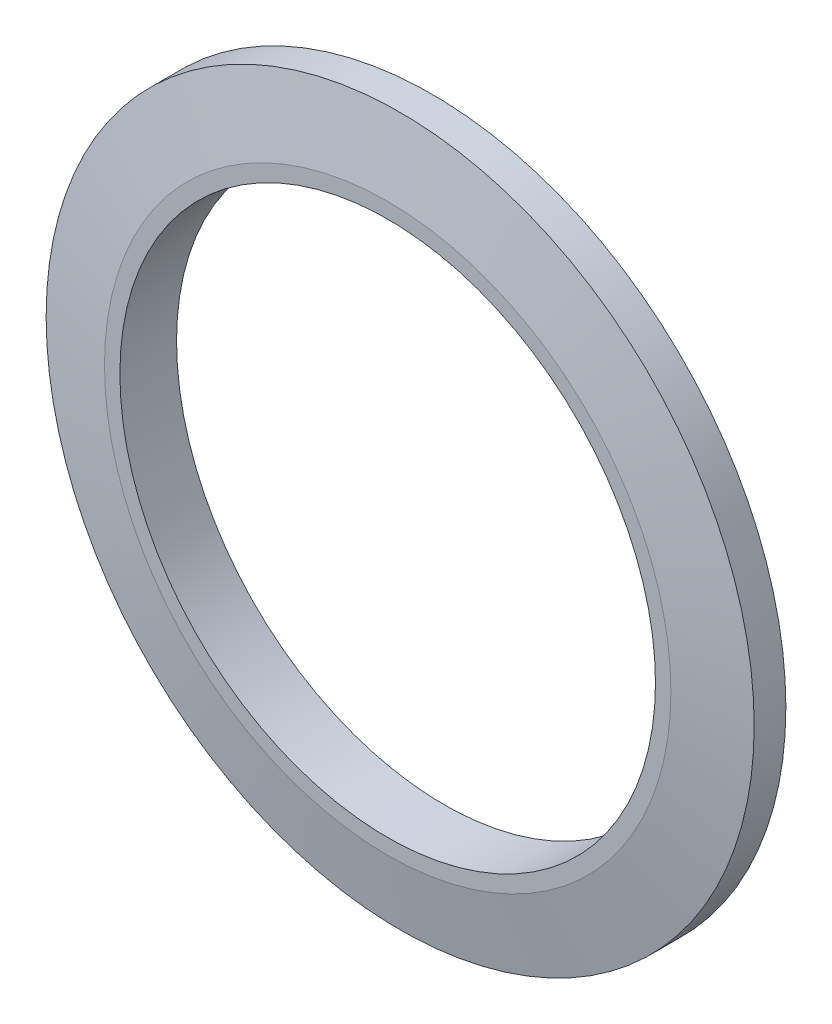
ISO-10303-21;
HEADER;
FILE_DESCRIPTION(('STEP AP214'),'2;1');
FILE_NAME('part.step','',(''),(''),'','','');
FILE_SCHEMA(('AUTOMOTIVE_DESIGN { 1 0 10303 214 1 1 1 1 }'));
ENDSEC;
DATA;
#1=APPLICATION_CONTEXT('core data for automotive mechanical design processes');
#2=APPLICATION_PROTOCOL_DEFINITION('international standard','automotive_design',2000,#1);
#3=PRODUCT_CONTEXT('',#1,'mechanical');
#4=PRODUCT('Part','Part','',(#3));
#5=PRODUCT_RELATED_PRODUCT_CATEGORY('part','',(#4));
#6=PRODUCT_DEFINITION_FORMATION('','',#4);
#7=PRODUCT_DEFINITION_CONTEXT('part definition',#1,'design');
#8=PRODUCT_DEFINITION('design','',#6,#7);
#9=PRODUCT_DEFINITION_SHAPE('','',#8);
#10=(LENGTH_UNIT() NAMED_UNIT(*) SI_UNIT(.MILLI.,.METRE.));
#11=(NAMED_UNIT(*) PLANE_ANGLE_UNIT() SI_UNIT($,.RADIAN.));
#12=(NAMED_UNIT(*) SI_UNIT($,.STERADIAN.) SOLID_ANGLE_UNIT());
#13=UNCERTAINTY_MEASURE_WITH_UNIT(LENGTH_MEASURE(1.E-05),#10,'distance_accuracy_value','');
#14=(GEOMETRIC_REPRESENTATION_CONTEXT(3) GLOBAL_UNCERTAINTY_ASSIGNED_CONTEXT((#13)) GLOBAL_UNIT_ASSIGNED_CONTEXT((#10,
#11,#12)) REPRESENTATION_CONTEXT('',''));
#15=CARTESIAN_POINT('',(0.,0.,0.));
#16=DIRECTION('',(0.,0.,1.));
#17=DIRECTION('',(1.,0.,0.));
#18=AXIS2_PLACEMENT_3D('',#15,#16,#17);
#19=CARTESIAN_POINT('',(0.,0.,2.));
#20=DIRECTION('',(0.,0.,1.));
#21=DIRECTION('',(1.,0.,0.));
#22=AXIS2_PLACEMENT_3D('',#19,#20,#21);
#23=PLANE('',#22);
#24=CARTESIAN_POINT('',(0.,0.,2.));
#25=DIRECTION('',(0.,0.,1.));
#26=DIRECTION('',(1.,0.,0.));
#27=AXIS2_PLACEMENT_3D('',#24,#25,#26);
#28=CIRCLE('',#27,9.455);
#29=CARTESIAN_POINT('',(9.455,0.,2.));
#30=VERTEX_POINT('',#29);
#31=EDGE_CURVE('E45',#30,#30,#28,.T.);
#32=ORIENTED_EDGE('',*,*,#31,.F.);
#33=EDGE_LOOP('',(#32));
#34=FACE_BOUND('',#33,.T.);
#35=CARTESIAN_POINT('',(0.,0.,2.));
#36=DIRECTION('',(0.,0.,-1.));
#37=DIRECTION('',(-1.,0.,0.));
#38=AXIS2_PLACEMENT_3D('',#35,#36,#37);
#39=CIRCLE('',#38,10.);
#40=CARTESIAN_POINT('',(-10.,0.,2.));
#41=VERTEX_POINT('',#40);
#42=EDGE_CURVE('E61',#41,#41,#39,.T.);
#43=ORIENTED_EDGE('',*,*,#42,.F.);
#44=EDGE_LOOP('',(#43));
#45=FACE_BOUND('',#44,.T.);
#46=ADVANCED_FACE('F41',(#34,#45),#23,.T.);
#47=CARTESIAN_POINT('',(0.,0.,0.));
#48=DIRECTION('',(0.,0.,1.));
#49=DIRECTION('',(1.,0.,0.));
#50=AXIS2_PLACEMENT_3D('',#47,#48,#49);
#51=PLANE('',#50);
#52=CARTESIAN_POINT('',(0.,0.,0.));
#53=DIRECTION('',(0.,0.,1.));
#54=DIRECTION('',(1.,0.,0.));
#55=AXIS2_PLACEMENT_3D('',#52,#53,#54);
#56=CIRCLE('',#55,9.455);
#57=CARTESIAN_POINT('',(9.455,0.,0.));
#58=VERTEX_POINT('',#57);
#59=EDGE_CURVE('E10',#58,#58,#56,.T.);
#60=ORIENTED_EDGE('',*,*,#59,.T.);
#61=EDGE_LOOP('',(#60));
#62=FACE_BOUND('',#61,.T.);
#63=CARTESIAN_POINT('',(0.,0.,0.));
#64=DIRECTION('',(0.,0.,-1.));
#65=DIRECTION('',(-1.,0.,0.));
#66=AXIS2_PLACEMENT_3D('',#63,#64,#65);
#67=CIRCLE('',#66,10.);
#68=CARTESIAN_POINT('',(-10.,0.,0.));
#69=VERTEX_POINT('',#68);
#70=EDGE_CURVE('E60',#69,#69,#67,.T.);
#71=ORIENTED_EDGE('',*,*,#70,.T.);
#72=EDGE_LOOP('',(#71));
#73=FACE_BOUND('',#72,.T.);
#74=ADVANCED_FACE('F72',(#62,#73),#51,.F.);
#75=CARTESIAN_POINT('',(0.,0.,0.));
#76=DIRECTION('',(0.,0.,1.));
#77=DIRECTION('',(1.,0.,0.));
#78=AXIS2_PLACEMENT_3D('',#75,#76,#77);
#79=CYLINDRICAL_SURFACE('',#78,9.455);
#80=ORIENTED_EDGE('',*,*,#59,.F.);
#81=EDGE_LOOP('',(#80));
#82=FACE_BOUND('',#81,.T.);
#83=ORIENTED_EDGE('',*,*,#31,.T.);
#84=EDGE_LOOP('',(#83));
#85=FACE_BOUND('',#84,.T.);
#86=ADVANCED_FACE('F78',(#82,#85),#79,.F.);
#87=CARTESIAN_POINT('',(0.,0.,0.440817451771171));
#88=DIRECTION('',(0.,0.,1.));
#89=DIRECTION('',(1.,0.,0.));
#90=AXIS2_PLACEMENT_3D('',#87,#88,#89);
#91=CONICAL_SURFACE('',#90,12.5,1.39626340159546);
#92=ORIENTED_EDGE('',*,*,#70,.F.);
#93=EDGE_LOOP('',(#92));
#94=FACE_BOUND('',#93,.T.);
#95=CARTESIAN_POINT('',(0.,0.,0.440817451771171));
#96=DIRECTION('',(0.,0.,-1.));
#97=DIRECTION('',(-1.,0.,0.));
#98=AXIS2_PLACEMENT_3D('',#95,#96,#97);
#99=CIRCLE('',#98,12.5);
#100=CARTESIAN_POINT('',(-12.5,0.,0.440817451771171));
#101=VERTEX_POINT('',#100);
#102=EDGE_CURVE('E54',#101,#101,#99,.T.);
#103=ORIENTED_EDGE('',*,*,#102,.T.);
#104=EDGE_LOOP('',(#103));
#105=FACE_BOUND('',#104,.T.);
#106=ADVANCED_FACE('F74',(#94,#105),#91,.T.);
#107=CARTESIAN_POINT('',(0.,0.,2.));
#108=DIRECTION('',(0.,0.,-1.));
#109=DIRECTION('',(-1.,0.,0.));
#110=AXIS2_PLACEMENT_3D('',#107,#108,#109);
#111=CONICAL_SURFACE('',#110,10.,1.39626340159547);
#112=CARTESIAN_POINT('',(0.,0.,1.55918254822885));
#113=DIRECTION('',(0.,0.,-1.));
#114=DIRECTION('',(-1.,0.,0.));
#115=AXIS2_PLACEMENT_3D('',#112,#113,#114);
#116=CIRCLE('',#115,12.5);
#117=CARTESIAN_POINT('',(-12.5,0.,1.55918254822885));
#118=VERTEX_POINT('',#117);
#119=EDGE_CURVE('E56',#118,#118,#116,.T.);
#120=ORIENTED_EDGE('',*,*,#119,.F.);
#121=EDGE_LOOP('',(#120));
#122=FACE_BOUND('',#121,.T.);
#123=ORIENTED_EDGE('',*,*,#42,.T.);
#124=EDGE_LOOP('',(#123));
#125=FACE_BOUND('',#124,.T.);
#126=ADVANCED_FACE('F77',(#122,#125),#111,.T.);
#127=CARTESIAN_POINT('',(0.,0.,2.));
#128=DIRECTION('',(0.,0.,-1.));
#129=DIRECTION('',(-1.,0.,0.));
#130=AXIS2_PLACEMENT_3D('',#127,#128,#129);
#131=CYLINDRICAL_SURFACE('',#130,12.5);
#132=ORIENTED_EDGE('',*,*,#102,.F.);
#133=EDGE_LOOP('',(#132));
#134=FACE_BOUND('',#133,.T.);
#135=ORIENTED_EDGE('',*,*,#119,.T.);
#136=EDGE_LOOP('',(#135));
#137=FACE_BOUND('',#136,.T.);
#138=ADVANCED_FACE('F43',(#134,#137),#131,.T.);
#139=CLOSED_SHELL('',(#46,#74,#86,#106,#126,#138));
#140=MANIFOLD_SOLID_BREP('B2',#139);
#141=ADVANCED_BREP_SHAPE_REPRESENTATION('',(#18,#140),#14);
#142=SHAPE_DEFINITION_REPRESENTATION(#9,#141);
ENDSEC;
END-ISO-10303-21;
